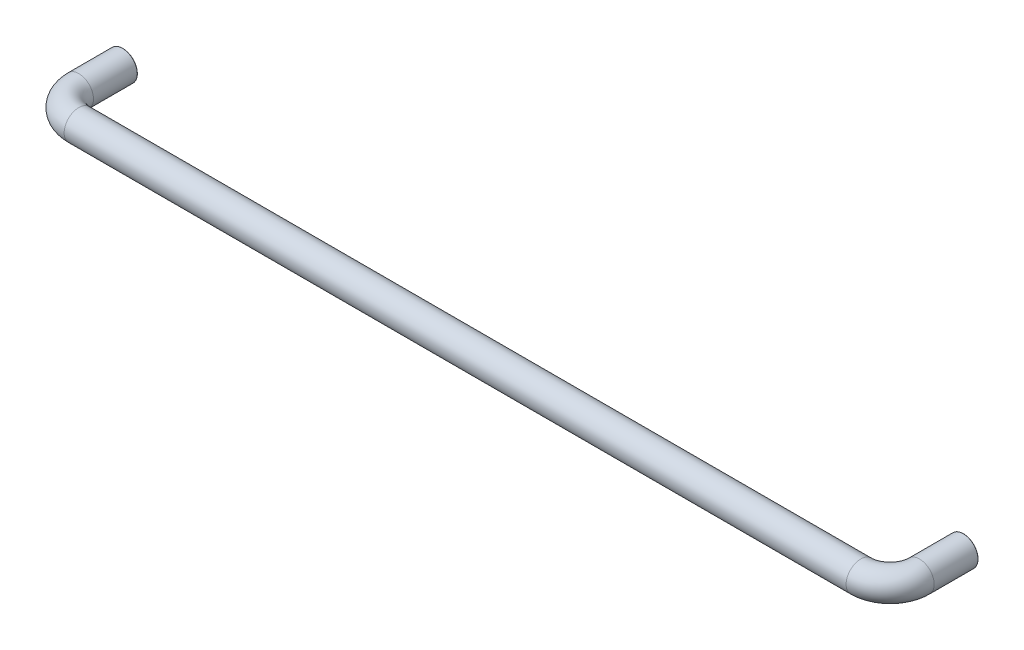
ISO-10303-21;
HEADER;
FILE_DESCRIPTION(('STEP AP214'),'2;1');
FILE_NAME('part.step','',(''),(''),'','','');
FILE_SCHEMA(('AUTOMOTIVE_DESIGN { 1 0 10303 214 1 1 1 1 }'));
ENDSEC;
DATA;
#1=APPLICATION_CONTEXT('core data for automotive mechanical design processes');
#2=APPLICATION_PROTOCOL_DEFINITION('international standard','automotive_design',2000,#1);
#3=PRODUCT_CONTEXT('',#1,'mechanical');
#4=PRODUCT('Part','Part','',(#3));
#5=PRODUCT_RELATED_PRODUCT_CATEGORY('part','',(#4));
#6=PRODUCT_DEFINITION_FORMATION('','',#4);
#7=PRODUCT_DEFINITION_CONTEXT('part definition',#1,'design');
#8=PRODUCT_DEFINITION('design','',#6,#7);
#9=PRODUCT_DEFINITION_SHAPE('','',#8);
#10=(LENGTH_UNIT() NAMED_UNIT(*) SI_UNIT(.MILLI.,.METRE.));
#11=(NAMED_UNIT(*) PLANE_ANGLE_UNIT() SI_UNIT($,.RADIAN.));
#12=(NAMED_UNIT(*) SI_UNIT($,.STERADIAN.) SOLID_ANGLE_UNIT());
#13=UNCERTAINTY_MEASURE_WITH_UNIT(LENGTH_MEASURE(1.E-05),#10,'distance_accuracy_value','');
#14=(GEOMETRIC_REPRESENTATION_CONTEXT(3) GLOBAL_UNCERTAINTY_ASSIGNED_CONTEXT((#13)) GLOBAL_UNIT_ASSIGNED_CONTEXT((#10,
#11,#12)) REPRESENTATION_CONTEXT('',''));
#15=CARTESIAN_POINT('',(0.,0.,0.));
#16=DIRECTION('',(0.,0.,1.));
#17=DIRECTION('',(1.,0.,0.));
#18=AXIS2_PLACEMENT_3D('',#15,#16,#17);
#19=CARTESIAN_POINT('',(-2908.3,0.,-508.));
#20=DIRECTION('',(0.,0.,1.));
#21=DIRECTION('',(1.,0.,0.));
#22=AXIS2_PLACEMENT_3D('',#19,#20,#21);
#23=CYLINDRICAL_SURFACE('',#22,101.6);
#24=CARTESIAN_POINT('',(-2908.3,0.,-505.46));
#25=DIRECTION('',(0.,0.,1.));
#26=DIRECTION('',(1.,0.,0.));
#27=AXIS2_PLACEMENT_3D('',#24,#25,#26);
#28=CIRCLE('',#27,101.6);
#29=CARTESIAN_POINT('',(-2806.7,0.,-505.46));
#30=VERTEX_POINT('',#29);
#31=EDGE_CURVE('E37',#30,#30,#28,.T.);
#32=ORIENTED_EDGE('',*,*,#31,.T.);
#33=EDGE_LOOP('',(#32));
#34=FACE_BOUND('',#33,.T.);
#35=CARTESIAN_POINT('',(-2908.3,0.,-203.2));
#36=DIRECTION('',(0.,0.,1.));
#37=DIRECTION('',(1.,0.,0.));
#38=AXIS2_PLACEMENT_3D('',#35,#36,#37);
#39=CIRCLE('',#38,101.6);
#40=CARTESIAN_POINT('',(-3009.9,0.,-203.2));
#41=VERTEX_POINT('',#40);
#42=EDGE_CURVE('E61',#41,#41,#39,.T.);
#43=ORIENTED_EDGE('',*,*,#42,.F.);
#44=EDGE_LOOP('',(#43));
#45=FACE_BOUND('',#44,.T.);
#46=ADVANCED_FACE('F30',(#34,#45),#23,.T.);
#47=CARTESIAN_POINT('',(-2705.1,0.,-203.2));
#48=DIRECTION('',(0.,1.,0.));
#49=DIRECTION('',(0.,0.,1.));
#50=AXIS2_PLACEMENT_3D('',#47,#48,#49);
#51=TOROIDAL_SURFACE('',#50,203.2,101.6);
#52=CARTESIAN_POINT('',(-2705.1,0.,0.));
#53=DIRECTION('',(1.,0.,0.));
#54=DIRECTION('',(0.,0.,-1.));
#55=AXIS2_PLACEMENT_3D('',#52,#53,#54);
#56=CIRCLE('',#55,101.6);
#57=CARTESIAN_POINT('',(-2705.1,0.,101.6));
#58=VERTEX_POINT('',#57);
#59=EDGE_CURVE('E58',#58,#58,#56,.T.);
#60=CARTESIAN_POINT('',(-2705.1,0.,-203.2));
#61=DIRECTION('',(0.,1.,0.));
#62=DIRECTION('',(0.,0.,1.));
#63=AXIS2_PLACEMENT_3D('',#60,#61,#62);
#64=CIRCLE('',#63,304.8);
#65=EDGE_CURVE('',#41,#58,#64,.T.);
#66=ORIENTED_EDGE('',*,*,#42,.T.);
#67=ORIENTED_EDGE('',*,*,#59,.F.);
#68=ORIENTED_EDGE('',*,*,#65,.T.);
#69=ORIENTED_EDGE('',*,*,#65,.F.);
#70=EDGE_LOOP('',(#66,#68,#67,#69));
#71=FACE_BOUND('',#70,.T.);
#72=ADVANCED_FACE('F157',(#71),#51,.T.);
#73=CARTESIAN_POINT('',(-2705.1,0.,0.));
#74=DIRECTION('',(1.,0.,0.));
#75=DIRECTION('',(0.,0.,-1.));
#76=AXIS2_PLACEMENT_3D('',#73,#74,#75);
#77=CYLINDRICAL_SURFACE('',#76,101.6);
#78=CARTESIAN_POINT('',(2705.1,0.,0.));
#79=DIRECTION('',(1.,0.,0.));
#80=DIRECTION('',(0.,0.,-1.));
#81=AXIS2_PLACEMENT_3D('',#78,#79,#80);
#82=CIRCLE('',#81,101.6);
#83=CARTESIAN_POINT('',(2705.1,0.,101.6));
#84=VERTEX_POINT('',#83);
#85=EDGE_CURVE('E55',#84,#84,#82,.T.);
#86=ORIENTED_EDGE('',*,*,#85,.F.);
#87=EDGE_LOOP('',(#86));
#88=FACE_BOUND('',#87,.T.);
#89=ORIENTED_EDGE('',*,*,#59,.T.);
#90=EDGE_LOOP('',(#89));
#91=FACE_BOUND('',#90,.T.);
#92=ADVANCED_FACE('F200',(#88,#91),#77,.T.);
#93=CARTESIAN_POINT('',(2705.1,0.,-203.2));
#94=DIRECTION('',(0.,1.,0.));
#95=DIRECTION('',(0.,0.,1.));
#96=AXIS2_PLACEMENT_3D('',#93,#94,#95);
#97=TOROIDAL_SURFACE('',#96,203.2,101.6);
#98=CARTESIAN_POINT('',(2908.3,0.,-203.2));
#99=DIRECTION('',(0.,0.,-1.));
#100=DIRECTION('',(-1.,0.,0.));
#101=AXIS2_PLACEMENT_3D('',#98,#99,#100);
#102=CIRCLE('',#101,101.6);
#103=CARTESIAN_POINT('',(3009.9,0.,-203.2));
#104=VERTEX_POINT('',#103);
#105=EDGE_CURVE('E51',#104,#104,#102,.T.);
#106=CARTESIAN_POINT('',(2705.1,0.,-203.2));
#107=DIRECTION('',(0.,1.,0.));
#108=DIRECTION('',(0.,0.,1.));
#109=AXIS2_PLACEMENT_3D('',#106,#107,#108);
#110=CIRCLE('',#109,304.8);
#111=EDGE_CURVE('',#84,#104,#110,.T.);
#112=ORIENTED_EDGE('',*,*,#85,.T.);
#113=ORIENTED_EDGE('',*,*,#105,.F.);
#114=ORIENTED_EDGE('',*,*,#111,.T.);
#115=ORIENTED_EDGE('',*,*,#111,.F.);
#116=EDGE_LOOP('',(#112,#114,#113,#115));
#117=FACE_BOUND('',#116,.T.);
#118=ADVANCED_FACE('F94',(#117),#97,.T.);
#119=CARTESIAN_POINT('',(2908.3,0.,-203.2));
#120=DIRECTION('',(0.,0.,-1.));
#121=DIRECTION('',(-1.,0.,0.));
#122=AXIS2_PLACEMENT_3D('',#119,#120,#121);
#123=CYLINDRICAL_SURFACE('',#122,101.6);
#124=CARTESIAN_POINT('',(2908.3,0.,-505.46));
#125=DIRECTION('',(0.,0.,-1.));
#126=DIRECTION('',(-1.,0.,0.));
#127=AXIS2_PLACEMENT_3D('',#124,#125,#126);
#128=CIRCLE('',#127,101.6);
#129=CARTESIAN_POINT('',(2806.7,0.,-505.46));
#130=VERTEX_POINT('',#129);
#131=EDGE_CURVE('E41',#130,#130,#128,.F.);
#132=ORIENTED_EDGE('',*,*,#131,.T.);
#133=EDGE_LOOP('',(#132));
#134=FACE_BOUND('',#133,.T.);
#135=ORIENTED_EDGE('',*,*,#105,.T.);
#136=EDGE_LOOP('',(#135));
#137=FACE_BOUND('',#136,.T.);
#138=ADVANCED_FACE('F86',(#134,#137),#123,.T.);
#139=CARTESIAN_POINT('',(-2908.3,0.,-508.));
#140=DIRECTION('',(0.,0.,1.));
#141=DIRECTION('',(1.,0.,0.));
#142=AXIS2_PLACEMENT_3D('',#139,#140,#141);
#143=PLANE('',#142);
#144=CARTESIAN_POINT('',(-2908.3,0.,-508.));
#145=DIRECTION('',(0.,0.,1.));
#146=DIRECTION('',(1.,0.,0.));
#147=AXIS2_PLACEMENT_3D('',#144,#145,#146);
#148=CIRCLE('',#147,99.0599999999999);
#149=CARTESIAN_POINT('',(-2809.24,0.,-508.));
#150=VERTEX_POINT('',#149);
#151=EDGE_CURVE('E10',#150,#150,#148,.F.);
#152=ORIENTED_EDGE('',*,*,#151,.T.);
#153=EDGE_LOOP('',(#152));
#154=FACE_BOUND('',#153,.T.);
#155=CARTESIAN_POINT('',(-2908.3,0.,-508.));
#156=DIRECTION('',(0.,0.,1.));
#157=DIRECTION('',(1.,0.,0.));
#158=AXIS2_PLACEMENT_3D('',#155,#156,#157);
#159=CIRCLE('',#158,88.9);
#160=CARTESIAN_POINT('',(-2819.4,0.,-508.));
#161=VERTEX_POINT('',#160);
#162=EDGE_CURVE('E54',#161,#161,#159,.F.);
#163=ORIENTED_EDGE('',*,*,#162,.F.);
#164=EDGE_LOOP('',(#163));
#165=FACE_BOUND('',#164,.T.);
#166=ADVANCED_FACE('F83',(#154,#165),#143,.F.);
#167=CARTESIAN_POINT('',(2908.3,0.,-508.));
#168=DIRECTION('',(0.,0.,-1.));
#169=DIRECTION('',(-1.,0.,0.));
#170=AXIS2_PLACEMENT_3D('',#167,#168,#169);
#171=PLANE('',#170);
#172=CARTESIAN_POINT('',(2908.3,0.,-508.));
#173=DIRECTION('',(0.,0.,-1.));
#174=DIRECTION('',(-1.,0.,0.));
#175=AXIS2_PLACEMENT_3D('',#172,#173,#174);
#176=CIRCLE('',#175,99.0599999999999);
#177=CARTESIAN_POINT('',(2809.24,0.,-508.));
#178=VERTEX_POINT('',#177);
#179=EDGE_CURVE('E45',#178,#178,#176,.T.);
#180=ORIENTED_EDGE('',*,*,#179,.T.);
#181=EDGE_LOOP('',(#180));
#182=FACE_BOUND('',#181,.T.);
#183=CARTESIAN_POINT('',(2908.3,0.,-508.));
#184=DIRECTION('',(0.,0.,-1.));
#185=DIRECTION('',(-1.,0.,0.));
#186=AXIS2_PLACEMENT_3D('',#183,#184,#185);
#187=CIRCLE('',#186,88.9);
#188=CARTESIAN_POINT('',(2819.4,0.,-508.));
#189=VERTEX_POINT('',#188);
#190=EDGE_CURVE('E50',#189,#189,#187,.F.);
#191=ORIENTED_EDGE('',*,*,#190,.T.);
#192=EDGE_LOOP('',(#191));
#193=FACE_BOUND('',#192,.T.);
#194=ADVANCED_FACE('F85',(#182,#193),#171,.T.);
#195=CARTESIAN_POINT('',(-2908.3,0.,-508.));
#196=DIRECTION('',(0.,0.,1.));
#197=DIRECTION('',(1.,0.,0.));
#198=AXIS2_PLACEMENT_3D('',#195,#196,#197);
#199=CYLINDRICAL_SURFACE('',#198,88.9);
#200=CARTESIAN_POINT('',(-2908.3,0.,-203.2));
#201=DIRECTION('',(0.,0.,1.));
#202=DIRECTION('',(1.,0.,0.));
#203=AXIS2_PLACEMENT_3D('',#200,#201,#202);
#204=CIRCLE('',#203,88.9);
#205=CARTESIAN_POINT('',(-2997.2,0.,-203.2));
#206=VERTEX_POINT('',#205);
#207=EDGE_CURVE('E75',#206,#206,#204,.F.);
#208=ORIENTED_EDGE('',*,*,#207,.F.);
#209=EDGE_LOOP('',(#208));
#210=FACE_BOUND('',#209,.T.);
#211=ORIENTED_EDGE('',*,*,#162,.T.);
#212=EDGE_LOOP('',(#211));
#213=FACE_BOUND('',#212,.T.);
#214=ADVANCED_FACE('F81',(#210,#213),#199,.F.);
#215=CARTESIAN_POINT('',(-2705.1,0.,-203.2));
#216=DIRECTION('',(0.,1.,0.));
#217=DIRECTION('',(0.,0.,1.));
#218=AXIS2_PLACEMENT_3D('',#215,#216,#217);
#219=TOROIDAL_SURFACE('',#218,203.2,88.9);
#220=CARTESIAN_POINT('',(-2705.1,0.,0.));
#221=DIRECTION('',(1.,0.,0.));
#222=DIRECTION('',(0.,0.,-1.));
#223=AXIS2_PLACEMENT_3D('',#220,#221,#222);
#224=CIRCLE('',#223,88.9);
#225=CARTESIAN_POINT('',(-2705.1,0.,88.8999999999998));
#226=VERTEX_POINT('',#225);
#227=EDGE_CURVE('E72',#226,#226,#224,.F.);
#228=CARTESIAN_POINT('',(-2705.1,0.,-203.2));
#229=DIRECTION('',(0.,1.,0.));
#230=DIRECTION('',(0.,0.,1.));
#231=AXIS2_PLACEMENT_3D('',#228,#229,#230);
#232=CIRCLE('',#231,292.1);
#233=EDGE_CURVE('',#206,#226,#232,.T.);
#234=ORIENTED_EDGE('',*,*,#207,.T.);
#235=ORIENTED_EDGE('',*,*,#227,.F.);
#236=ORIENTED_EDGE('',*,*,#233,.T.);
#237=ORIENTED_EDGE('',*,*,#233,.F.);
#238=EDGE_LOOP('',(#234,#236,#235,#237));
#239=FACE_BOUND('',#238,.T.);
#240=ADVANCED_FACE('F117',(#239),#219,.F.);
#241=CARTESIAN_POINT('',(-2705.1,0.,0.));
#242=DIRECTION('',(1.,0.,0.));
#243=DIRECTION('',(0.,0.,-1.));
#244=AXIS2_PLACEMENT_3D('',#241,#242,#243);
#245=CYLINDRICAL_SURFACE('',#244,88.9);
#246=CARTESIAN_POINT('',(2705.1,0.,0.));
#247=DIRECTION('',(1.,0.,0.));
#248=DIRECTION('',(0.,0.,-1.));
#249=AXIS2_PLACEMENT_3D('',#246,#247,#248);
#250=CIRCLE('',#249,88.9);
#251=CARTESIAN_POINT('',(2705.1,0.,88.9));
#252=VERTEX_POINT('',#251);
#253=EDGE_CURVE('E69',#252,#252,#250,.F.);
#254=ORIENTED_EDGE('',*,*,#253,.F.);
#255=EDGE_LOOP('',(#254));
#256=FACE_BOUND('',#255,.T.);
#257=ORIENTED_EDGE('',*,*,#227,.T.);
#258=EDGE_LOOP('',(#257));
#259=FACE_BOUND('',#258,.T.);
#260=ADVANCED_FACE('F109',(#256,#259),#245,.F.);
#261=CARTESIAN_POINT('',(2705.1,0.,-203.2));
#262=DIRECTION('',(0.,1.,0.));
#263=DIRECTION('',(0.,0.,1.));
#264=AXIS2_PLACEMENT_3D('',#261,#262,#263);
#265=TOROIDAL_SURFACE('',#264,203.2,88.9);
#266=CARTESIAN_POINT('',(2908.3,0.,-203.2));
#267=DIRECTION('',(0.,0.,-1.));
#268=DIRECTION('',(-1.,0.,0.));
#269=AXIS2_PLACEMENT_3D('',#266,#267,#268);
#270=CIRCLE('',#269,88.9);
#271=CARTESIAN_POINT('',(2997.2,0.,-203.2));
#272=VERTEX_POINT('',#271);
#273=EDGE_CURVE('E66',#272,#272,#270,.F.);
#274=CARTESIAN_POINT('',(2705.1,0.,-203.2));
#275=DIRECTION('',(0.,1.,0.));
#276=DIRECTION('',(0.,0.,1.));
#277=AXIS2_PLACEMENT_3D('',#274,#275,#276);
#278=CIRCLE('',#277,292.1);
#279=EDGE_CURVE('',#252,#272,#278,.T.);
#280=ORIENTED_EDGE('',*,*,#253,.T.);
#281=ORIENTED_EDGE('',*,*,#273,.F.);
#282=ORIENTED_EDGE('',*,*,#279,.T.);
#283=ORIENTED_EDGE('',*,*,#279,.F.);
#284=EDGE_LOOP('',(#280,#282,#281,#283));
#285=FACE_BOUND('',#284,.T.);
#286=ADVANCED_FACE('F101',(#285),#265,.F.);
#287=CARTESIAN_POINT('',(2908.3,0.,-203.2));
#288=DIRECTION('',(0.,0.,-1.));
#289=DIRECTION('',(-1.,0.,0.));
#290=AXIS2_PLACEMENT_3D('',#287,#288,#289);
#291=CYLINDRICAL_SURFACE('',#290,88.9);
#292=ORIENTED_EDGE('',*,*,#190,.F.);
#293=EDGE_LOOP('',(#292));
#294=FACE_BOUND('',#293,.T.);
#295=ORIENTED_EDGE('',*,*,#273,.T.);
#296=EDGE_LOOP('',(#295));
#297=FACE_BOUND('',#296,.T.);
#298=ADVANCED_FACE('F98',(#294,#297),#291,.F.);
#299=CARTESIAN_POINT('',(2908.3,0.,-505.46));
#300=DIRECTION('',(0.,0.,-1.));
#301=DIRECTION('',(-1.,0.,0.));
#302=AXIS2_PLACEMENT_3D('',#299,#300,#301);
#303=TOROIDAL_SURFACE('',#302,99.0599999999999,2.54);
#304=ORIENTED_EDGE('',*,*,#131,.F.);
#305=EDGE_LOOP('',(#304));
#306=FACE_BOUND('',#305,.T.);
#307=ORIENTED_EDGE('',*,*,#179,.F.);
#308=EDGE_LOOP('',(#307));
#309=FACE_BOUND('',#308,.T.);
#310=ADVANCED_FACE('F100',(#306,#309),#303,.T.);
#311=CARTESIAN_POINT('',(-2908.3,0.,-505.46));
#312=DIRECTION('',(0.,0.,1.));
#313=DIRECTION('',(1.,0.,0.));
#314=AXIS2_PLACEMENT_3D('',#311,#312,#313);
#315=TOROIDAL_SURFACE('',#314,99.0599999999999,2.54);
#316=ORIENTED_EDGE('',*,*,#151,.F.);
#317=EDGE_LOOP('',(#316));
#318=FACE_BOUND('',#317,.T.);
#319=ORIENTED_EDGE('',*,*,#31,.F.);
#320=EDGE_LOOP('',(#319));
#321=FACE_BOUND('',#320,.T.);
#322=ADVANCED_FACE('F32',(#318,#321),#315,.T.);
#323=CLOSED_SHELL('',(#46,#72,#92,#118,#138,#166,#194,#214,#240,#260,#286,#298,#310,#322));
#324=MANIFOLD_SOLID_BREP('B2',#323);
#325=ADVANCED_BREP_SHAPE_REPRESENTATION('',(#18,#324),#14);
#326=SHAPE_DEFINITION_REPRESENTATION(#9,#325);
ENDSEC;
END-ISO-10303-21;
